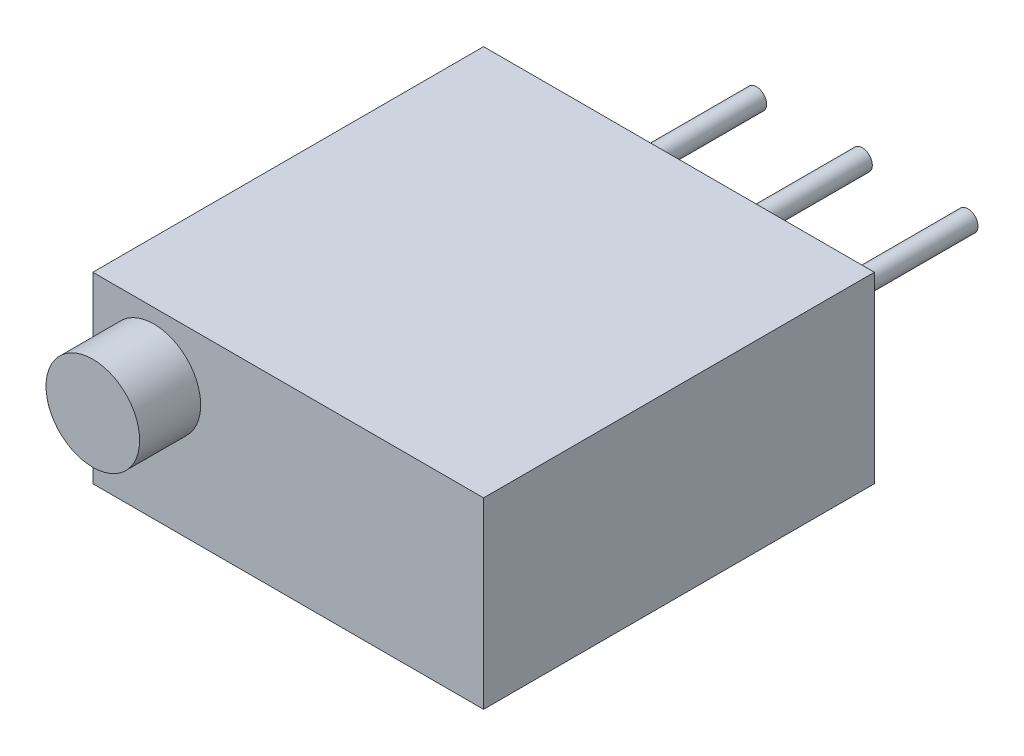
ISO-10303-21;
HEADER;
FILE_DESCRIPTION(('STEP AP214'),'2;1');
FILE_NAME('part.step','',(''),(''),'','','');
FILE_SCHEMA(('AUTOMOTIVE_DESIGN { 1 0 10303 214 1 1 1 1 }'));
ENDSEC;
DATA;
#1=APPLICATION_CONTEXT('core data for automotive mechanical design processes');
#2=APPLICATION_PROTOCOL_DEFINITION('international standard','automotive_design',2000,#1);
#3=PRODUCT_CONTEXT('',#1,'mechanical');
#4=PRODUCT('Part','Part','',(#3));
#5=PRODUCT_RELATED_PRODUCT_CATEGORY('part','',(#4));
#6=PRODUCT_DEFINITION_FORMATION('','',#4);
#7=PRODUCT_DEFINITION_CONTEXT('part definition',#1,'design');
#8=PRODUCT_DEFINITION('design','',#6,#7);
#9=PRODUCT_DEFINITION_SHAPE('','',#8);
#10=(LENGTH_UNIT() NAMED_UNIT(*) SI_UNIT(.MILLI.,.METRE.));
#11=(NAMED_UNIT(*) PLANE_ANGLE_UNIT() SI_UNIT($,.RADIAN.));
#12=(NAMED_UNIT(*) SI_UNIT($,.STERADIAN.) SOLID_ANGLE_UNIT());
#13=UNCERTAINTY_MEASURE_WITH_UNIT(LENGTH_MEASURE(1.E-05),#10,'distance_accuracy_value','');
#14=(GEOMETRIC_REPRESENTATION_CONTEXT(3) GLOBAL_UNCERTAINTY_ASSIGNED_CONTEXT((#13)) GLOBAL_UNIT_ASSIGNED_CONTEXT((#10,
#11,#12)) REPRESENTATION_CONTEXT('',''));
#15=CARTESIAN_POINT('',(0.,0.,0.));
#16=DIRECTION('',(0.,0.,1.));
#17=DIRECTION('',(1.,0.,0.));
#18=AXIS2_PLACEMENT_3D('',#15,#16,#17);
#19=CARTESIAN_POINT('',(-4.79999999999999,4.5,4.79999999999999));
#20=DIRECTION('',(0.,0.,-1.));
#21=DIRECTION('',(-1.,0.,0.));
#22=AXIS2_PLACEMENT_3D('',#19,#20,#21);
#23=PLANE('',#22);
#24=DIRECTION('',(1.,0.,0.));
#25=VECTOR('',#24,1.);
#26=CARTESIAN_POINT('',(-4.79999999999999,0.,4.79999999999999));
#27=LINE('',#26,#25);
#28=CARTESIAN_POINT('',(-4.79999999999999,0.,4.79999999999999));
#29=VERTEX_POINT('',#28);
#30=CARTESIAN_POINT('',(4.80000000000001,0.,4.79999999999999));
#31=VERTEX_POINT('',#30);
#32=EDGE_CURVE('E75',#29,#31,#27,.T.);
#33=ORIENTED_EDGE('',*,*,#32,.T.);
#34=DIRECTION('',(0.,-1.,0.));
#35=VECTOR('',#34,1.);
#36=CARTESIAN_POINT('',(4.80000000000001,4.5,4.79999999999999));
#37=LINE('',#36,#35);
#38=CARTESIAN_POINT('',(4.80000000000001,4.5,4.79999999999999));
#39=VERTEX_POINT('',#38);
#40=EDGE_CURVE('E93',#39,#31,#37,.T.);
#41=ORIENTED_EDGE('',*,*,#40,.F.);
#42=DIRECTION('',(1.,0.,0.));
#43=VECTOR('',#42,1.);
#44=CARTESIAN_POINT('',(-4.79999999999999,4.5,4.79999999999999));
#45=LINE('',#44,#43);
#46=CARTESIAN_POINT('',(-4.79999999999999,4.5,4.79999999999999));
#47=VERTEX_POINT('',#46);
#48=EDGE_CURVE('E89',#47,#39,#45,.T.);
#49=ORIENTED_EDGE('',*,*,#48,.F.);
#50=DIRECTION('',(0.,-1.,0.));
#51=VECTOR('',#50,1.);
#52=CARTESIAN_POINT('',(-4.79999999999999,4.5,4.79999999999999));
#53=LINE('',#52,#51);
#54=EDGE_CURVE('E87',#47,#29,#53,.T.);
#55=ORIENTED_EDGE('',*,*,#54,.T.);
#56=EDGE_LOOP('',(#33,#41,#49,#55));
#57=FACE_BOUND('',#56,.T.);
#58=CARTESIAN_POINT('',(-3.29999999999999,3.,4.79999999999999));
#59=DIRECTION('',(0.,0.,-1.));
#60=DIRECTION('',(-1.,0.,0.));
#61=AXIS2_PLACEMENT_3D('',#58,#59,#60);
#62=CIRCLE('',#61,1.15);
#63=CARTESIAN_POINT('',(-4.44999999999999,3.,4.79999999999999));
#64=VERTEX_POINT('',#63);
#65=EDGE_CURVE('E11',#64,#64,#62,.F.);
#66=ORIENTED_EDGE('',*,*,#65,.F.);
#67=EDGE_LOOP('',(#66));
#68=FACE_BOUND('',#67,.T.);
#69=ADVANCED_FACE('F34',(#57,#68),#23,.F.);
#70=CARTESIAN_POINT('',(-4.79999999999999,4.5,-4.80000000000001));
#71=DIRECTION('',(0.,0.,1.));
#72=DIRECTION('',(1.,0.,0.));
#73=AXIS2_PLACEMENT_3D('',#70,#71,#72);
#74=PLANE('',#73);
#75=CARTESIAN_POINT('',(-2.59597838181529,2.25,-4.80000000000001));
#76=DIRECTION('',(0.,0.,1.));
#77=DIRECTION('',(1.,0.,0.));
#78=AXIS2_PLACEMENT_3D('',#75,#76,#77);
#79=CIRCLE('',#78,0.25);
#80=CARTESIAN_POINT('',(-2.34597838181529,2.25,-4.80000000000001));
#81=VERTEX_POINT('',#80);
#82=EDGE_CURVE('E119',#81,#81,#79,.F.);
#83=ORIENTED_EDGE('',*,*,#82,.F.);
#84=EDGE_LOOP('',(#83));
#85=FACE_BOUND('',#84,.T.);
#86=DIRECTION('',(-1.,0.,0.));
#87=VECTOR('',#86,1.);
#88=CARTESIAN_POINT('',(-4.79999999999999,0.,-4.80000000000001));
#89=LINE('',#88,#87);
#90=CARTESIAN_POINT('',(4.80000000000001,0.,-4.80000000000001));
#91=VERTEX_POINT('',#90);
#92=CARTESIAN_POINT('',(-4.79999999999999,0.,-4.80000000000001));
#93=VERTEX_POINT('',#92);
#94=EDGE_CURVE('E105',#91,#93,#89,.T.);
#95=ORIENTED_EDGE('',*,*,#94,.T.);
#96=DIRECTION('',(0.,-1.,0.));
#97=VECTOR('',#96,1.);
#98=CARTESIAN_POINT('',(-4.79999999999999,4.5,-4.80000000000001));
#99=LINE('',#98,#97);
#100=CARTESIAN_POINT('',(-4.79999999999999,4.5,-4.80000000000001));
#101=VERTEX_POINT('',#100);
#102=EDGE_CURVE('E96',#101,#93,#99,.T.);
#103=ORIENTED_EDGE('',*,*,#102,.F.);
#104=DIRECTION('',(-1.,0.,0.));
#105=VECTOR('',#104,1.);
#106=CARTESIAN_POINT('',(-4.79999999999999,4.5,-4.80000000000001));
#107=LINE('',#106,#105);
#108=CARTESIAN_POINT('',(4.80000000000001,4.5,-4.80000000000001));
#109=VERTEX_POINT('',#108);
#110=EDGE_CURVE('E49',#109,#101,#107,.T.);
#111=ORIENTED_EDGE('',*,*,#110,.F.);
#112=DIRECTION('',(0.,-1.,0.));
#113=VECTOR('',#112,1.);
#114=CARTESIAN_POINT('',(4.80000000000001,4.5,-4.80000000000001));
#115=LINE('',#114,#113);
#116=EDGE_CURVE('E113',#109,#91,#115,.T.);
#117=ORIENTED_EDGE('',*,*,#116,.T.);
#118=EDGE_LOOP('',(#95,#103,#111,#117));
#119=FACE_BOUND('',#118,.T.);
#120=CARTESIAN_POINT('',(0.,2.25,-4.80000000000001));
#121=DIRECTION('',(0.,0.,1.));
#122=DIRECTION('',(1.,0.,0.));
#123=AXIS2_PLACEMENT_3D('',#120,#121,#122);
#124=CIRCLE('',#123,0.25);
#125=CARTESIAN_POINT('',(0.250000000000008,2.25,-4.80000000000001));
#126=VERTEX_POINT('',#125);
#127=EDGE_CURVE('E92',#126,#126,#124,.F.);
#128=ORIENTED_EDGE('',*,*,#127,.F.);
#129=EDGE_LOOP('',(#128));
#130=FACE_BOUND('',#129,.T.);
#131=CARTESIAN_POINT('',(2.5959783818153,2.25,-4.80000000000001));
#132=DIRECTION('',(0.,0.,1.));
#133=DIRECTION('',(1.,0.,0.));
#134=AXIS2_PLACEMENT_3D('',#131,#132,#133);
#135=CIRCLE('',#134,0.25);
#136=CARTESIAN_POINT('',(2.8459783818153,2.25,-4.80000000000001));
#137=VERTEX_POINT('',#136);
#138=EDGE_CURVE('E42',#137,#137,#135,.F.);
#139=ORIENTED_EDGE('',*,*,#138,.F.);
#140=EDGE_LOOP('',(#139));
#141=FACE_BOUND('',#140,.T.);
#142=ADVANCED_FACE('F126',(#85,#119,#130,#141),#74,.F.);
#143=CARTESIAN_POINT('',(-4.79999999999999,4.5,-4.80000000000001));
#144=DIRECTION('',(1.,0.,0.));
#145=DIRECTION('',(0.,0.,-1.));
#146=AXIS2_PLACEMENT_3D('',#143,#144,#145);
#147=PLANE('',#146);
#148=DIRECTION('',(0.,0.,1.));
#149=VECTOR('',#148,1.);
#150=CARTESIAN_POINT('',(-4.79999999999999,0.,-4.80000000000001));
#151=LINE('',#150,#149);
#152=EDGE_CURVE('E80',#93,#29,#151,.T.);
#153=ORIENTED_EDGE('',*,*,#152,.T.);
#154=ORIENTED_EDGE('',*,*,#54,.F.);
#155=DIRECTION('',(0.,0.,1.));
#156=VECTOR('',#155,1.);
#157=CARTESIAN_POINT('',(-4.79999999999999,4.5,-4.80000000000001));
#158=LINE('',#157,#156);
#159=EDGE_CURVE('E107',#101,#47,#158,.T.);
#160=ORIENTED_EDGE('',*,*,#159,.F.);
#161=ORIENTED_EDGE('',*,*,#102,.T.);
#162=EDGE_LOOP('',(#153,#154,#160,#161));
#163=FACE_BOUND('',#162,.T.);
#164=ADVANCED_FACE('F36',(#163),#147,.F.);
#165=CARTESIAN_POINT('',(4.80000000000001,4.5,-4.80000000000001));
#166=DIRECTION('',(-1.,0.,0.));
#167=DIRECTION('',(0.,0.,1.));
#168=AXIS2_PLACEMENT_3D('',#165,#166,#167);
#169=PLANE('',#168);
#170=DIRECTION('',(0.,0.,-1.));
#171=VECTOR('',#170,1.);
#172=CARTESIAN_POINT('',(4.80000000000001,0.,-4.80000000000001));
#173=LINE('',#172,#171);
#174=EDGE_CURVE('E81',#31,#91,#173,.T.);
#175=ORIENTED_EDGE('',*,*,#174,.T.);
#176=ORIENTED_EDGE('',*,*,#116,.F.);
#177=DIRECTION('',(0.,0.,-1.));
#178=VECTOR('',#177,1.);
#179=CARTESIAN_POINT('',(4.80000000000001,4.5,-4.80000000000001));
#180=LINE('',#179,#178);
#181=EDGE_CURVE('E54',#39,#109,#180,.T.);
#182=ORIENTED_EDGE('',*,*,#181,.F.);
#183=ORIENTED_EDGE('',*,*,#40,.T.);
#184=EDGE_LOOP('',(#175,#176,#182,#183));
#185=FACE_BOUND('',#184,.T.);
#186=ADVANCED_FACE('F134',(#185),#169,.F.);
#187=CARTESIAN_POINT('',(-4.79999999999999,4.5,-4.80000000000001));
#188=DIRECTION('',(0.,1.,0.));
#189=DIRECTION('',(0.,0.,1.));
#190=AXIS2_PLACEMENT_3D('',#187,#188,#189);
#191=PLANE('',#190);
#192=ORIENTED_EDGE('',*,*,#159,.T.);
#193=ORIENTED_EDGE('',*,*,#48,.T.);
#194=ORIENTED_EDGE('',*,*,#181,.T.);
#195=ORIENTED_EDGE('',*,*,#110,.T.);
#196=EDGE_LOOP('',(#192,#193,#194,#195));
#197=FACE_BOUND('',#196,.T.);
#198=ADVANCED_FACE('F139',(#197),#191,.T.);
#199=CARTESIAN_POINT('',(-4.79999999999999,0.,-4.80000000000001));
#200=DIRECTION('',(0.,1.,0.));
#201=DIRECTION('',(0.,0.,1.));
#202=AXIS2_PLACEMENT_3D('',#199,#200,#201);
#203=PLANE('',#202);
#204=ORIENTED_EDGE('',*,*,#152,.F.);
#205=ORIENTED_EDGE('',*,*,#94,.F.);
#206=ORIENTED_EDGE('',*,*,#174,.F.);
#207=ORIENTED_EDGE('',*,*,#32,.F.);
#208=EDGE_LOOP('',(#204,#205,#206,#207));
#209=FACE_BOUND('',#208,.T.);
#210=ADVANCED_FACE('F77',(#209),#203,.F.);
#211=CARTESIAN_POINT('',(0.,2.25,-9.3));
#212=DIRECTION('',(0.,0.,1.));
#213=DIRECTION('',(1.,0.,0.));
#214=AXIS2_PLACEMENT_3D('',#211,#212,#213);
#215=CYLINDRICAL_SURFACE('',#214,0.25);
#216=CARTESIAN_POINT('',(0.,2.25,-9.3));
#217=DIRECTION('',(0.,0.,-1.));
#218=DIRECTION('',(-1.,0.,0.));
#219=AXIS2_PLACEMENT_3D('',#216,#217,#218);
#220=CIRCLE('',#219,0.25);
#221=CARTESIAN_POINT('',(-0.249999999999992,2.25,-9.3));
#222=VERTEX_POINT('',#221);
#223=EDGE_CURVE('E97',#222,#222,#220,.T.);
#224=ORIENTED_EDGE('',*,*,#223,.F.);
#225=EDGE_LOOP('',(#224));
#226=FACE_BOUND('',#225,.T.);
#227=ORIENTED_EDGE('',*,*,#127,.T.);
#228=EDGE_LOOP('',(#227));
#229=FACE_BOUND('',#228,.T.);
#230=ADVANCED_FACE('F149',(#226,#229),#215,.T.);
#231=CARTESIAN_POINT('',(0.,2.25,-9.3));
#232=DIRECTION('',(0.,0.,-1.));
#233=DIRECTION('',(-1.,0.,0.));
#234=AXIS2_PLACEMENT_3D('',#231,#232,#233);
#235=PLANE('',#234);
#236=ORIENTED_EDGE('',*,*,#223,.T.);
#237=EDGE_LOOP('',(#236));
#238=FACE_BOUND('',#237,.T.);
#239=ADVANCED_FACE('F151',(#238),#235,.T.);
#240=CARTESIAN_POINT('',(-2.59597838181529,2.25,-9.3));
#241=DIRECTION('',(0.,0.,1.));
#242=DIRECTION('',(1.,0.,0.));
#243=AXIS2_PLACEMENT_3D('',#240,#241,#242);
#244=CYLINDRICAL_SURFACE('',#243,0.25);
#245=CARTESIAN_POINT('',(-2.59597838181529,2.25,-9.3));
#246=DIRECTION('',(0.,0.,-1.));
#247=DIRECTION('',(-1.,0.,0.));
#248=AXIS2_PLACEMENT_3D('',#245,#246,#247);
#249=CIRCLE('',#248,0.25);
#250=CARTESIAN_POINT('',(-2.84597838181529,2.25,-9.3));
#251=VERTEX_POINT('',#250);
#252=EDGE_CURVE('E100',#251,#251,#249,.T.);
#253=ORIENTED_EDGE('',*,*,#252,.F.);
#254=EDGE_LOOP('',(#253));
#255=FACE_BOUND('',#254,.T.);
#256=ORIENTED_EDGE('',*,*,#82,.T.);
#257=EDGE_LOOP('',(#256));
#258=FACE_BOUND('',#257,.T.);
#259=ADVANCED_FACE('F158',(#255,#258),#244,.T.);
#260=CARTESIAN_POINT('',(-2.59597838181529,2.25,-9.3));
#261=DIRECTION('',(0.,0.,-1.));
#262=DIRECTION('',(-1.,0.,0.));
#263=AXIS2_PLACEMENT_3D('',#260,#261,#262);
#264=PLANE('',#263);
#265=ORIENTED_EDGE('',*,*,#252,.T.);
#266=EDGE_LOOP('',(#265));
#267=FACE_BOUND('',#266,.T.);
#268=ADVANCED_FACE('F165',(#267),#264,.T.);
#269=CARTESIAN_POINT('',(2.5959783818153,2.25,-9.3));
#270=DIRECTION('',(0.,0.,1.));
#271=DIRECTION('',(1.,0.,0.));
#272=AXIS2_PLACEMENT_3D('',#269,#270,#271);
#273=CYLINDRICAL_SURFACE('',#272,0.25);
#274=CARTESIAN_POINT('',(2.5959783818153,2.25,-9.3));
#275=DIRECTION('',(0.,0.,-1.));
#276=DIRECTION('',(1.,0.,0.));
#277=AXIS2_PLACEMENT_3D('',#274,#275,#276);
#278=CIRCLE('',#277,0.25);
#279=CARTESIAN_POINT('',(2.8459783818153,2.25,-9.3));
#280=VERTEX_POINT('',#279);
#281=EDGE_CURVE('E189',#280,#280,#278,.T.);
#282=ORIENTED_EDGE('',*,*,#281,.F.);
#283=EDGE_LOOP('',(#282));
#284=FACE_BOUND('',#283,.T.);
#285=ORIENTED_EDGE('',*,*,#138,.T.);
#286=EDGE_LOOP('',(#285));
#287=FACE_BOUND('',#286,.T.);
#288=ADVANCED_FACE('F124',(#284,#287),#273,.T.);
#289=CARTESIAN_POINT('',(2.5959783818153,2.25,-9.3));
#290=DIRECTION('',(0.,0.,1.));
#291=DIRECTION('',(1.,0.,0.));
#292=AXIS2_PLACEMENT_3D('',#289,#290,#291);
#293=PLANE('',#292);
#294=ORIENTED_EDGE('',*,*,#281,.T.);
#295=EDGE_LOOP('',(#294));
#296=FACE_BOUND('',#295,.T.);
#297=ADVANCED_FACE('F172',(#296),#293,.F.);
#298=CARTESIAN_POINT('',(-3.29999999999999,3.,6.29999999999999));
#299=DIRECTION('',(0.,0.,-1.));
#300=DIRECTION('',(-1.,0.,0.));
#301=AXIS2_PLACEMENT_3D('',#298,#299,#300);
#302=CYLINDRICAL_SURFACE('',#301,1.15);
#303=CARTESIAN_POINT('',(-3.29999999999999,3.,6.29999999999999));
#304=DIRECTION('',(0.,0.,1.));
#305=DIRECTION('',(1.,0.,0.));
#306=AXIS2_PLACEMENT_3D('',#303,#304,#305);
#307=CIRCLE('',#306,1.15);
#308=CARTESIAN_POINT('',(-2.14999999999999,3.,6.29999999999999));
#309=VERTEX_POINT('',#308);
#310=EDGE_CURVE('E188',#309,#309,#307,.T.);
#311=ORIENTED_EDGE('',*,*,#310,.F.);
#312=EDGE_LOOP('',(#311));
#313=FACE_BOUND('',#312,.T.);
#314=ORIENTED_EDGE('',*,*,#65,.T.);
#315=EDGE_LOOP('',(#314));
#316=FACE_BOUND('',#315,.T.);
#317=ADVANCED_FACE('F176',(#313,#316),#302,.T.);
#318=CARTESIAN_POINT('',(-3.29999999999999,3.,6.29999999999999));
#319=DIRECTION('',(0.,0.,1.));
#320=DIRECTION('',(1.,0.,0.));
#321=AXIS2_PLACEMENT_3D('',#318,#319,#320);
#322=PLANE('',#321);
#323=ORIENTED_EDGE('',*,*,#310,.T.);
#324=EDGE_LOOP('',(#323));
#325=FACE_BOUND('',#324,.T.);
#326=ADVANCED_FACE('F180',(#325),#322,.T.);
#327=CLOSED_SHELL('',(#69,#142,#164,#186,#198,#210,#230,#239,#259,#268,#288,#297,#317,#326));
#328=MANIFOLD_SOLID_BREP('B2',#327);
#329=ADVANCED_BREP_SHAPE_REPRESENTATION('',(#18,#328),#14);
#330=SHAPE_DEFINITION_REPRESENTATION(#9,#329);
ENDSEC;
END-ISO-10303-21;
